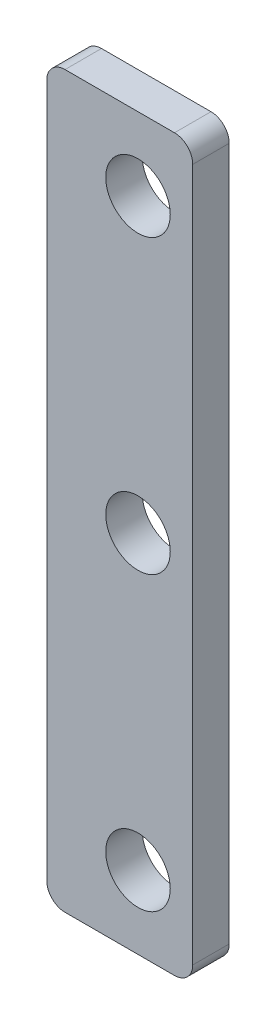
ISO-10303-21;
HEADER;
FILE_DESCRIPTION(('STEP AP214'),'2;1');
FILE_NAME('part.step','',(''),(''),'','','');
FILE_SCHEMA(('AUTOMOTIVE_DESIGN { 1 0 10303 214 1 1 1 1 }'));
ENDSEC;
DATA;
#1=APPLICATION_CONTEXT('core data for automotive mechanical design processes');
#2=APPLICATION_PROTOCOL_DEFINITION('international standard','automotive_design',2000,#1);
#3=PRODUCT_CONTEXT('',#1,'mechanical');
#4=PRODUCT('Part','Part','',(#3));
#5=PRODUCT_RELATED_PRODUCT_CATEGORY('part','',(#4));
#6=PRODUCT_DEFINITION_FORMATION('','',#4);
#7=PRODUCT_DEFINITION_CONTEXT('part definition',#1,'design');
#8=PRODUCT_DEFINITION('design','',#6,#7);
#9=PRODUCT_DEFINITION_SHAPE('','',#8);
#10=(LENGTH_UNIT() NAMED_UNIT(*) SI_UNIT(.MILLI.,.METRE.));
#11=(NAMED_UNIT(*) PLANE_ANGLE_UNIT() SI_UNIT($,.RADIAN.));
#12=(NAMED_UNIT(*) SI_UNIT($,.STERADIAN.) SOLID_ANGLE_UNIT());
#13=UNCERTAINTY_MEASURE_WITH_UNIT(LENGTH_MEASURE(1.E-05),#10,'distance_accuracy_value','');
#14=(GEOMETRIC_REPRESENTATION_CONTEXT(3) GLOBAL_UNCERTAINTY_ASSIGNED_CONTEXT((#13)) GLOBAL_UNIT_ASSIGNED_CONTEXT((#10,
#11,#12)) REPRESENTATION_CONTEXT('',''));
#15=CARTESIAN_POINT('',(0.,0.,0.));
#16=DIRECTION('',(0.,0.,1.));
#17=DIRECTION('',(1.,0.,0.));
#18=AXIS2_PLACEMENT_3D('',#15,#16,#17);
#19=CARTESIAN_POINT('',(6.35,-31.75,3.175));
#20=DIRECTION('',(-1.,0.,0.));
#21=DIRECTION('',(0.,0.,1.));
#22=AXIS2_PLACEMENT_3D('',#19,#20,#21);
#23=PLANE('',#22);
#24=DIRECTION('',(0.,1.,0.));
#25=VECTOR('',#24,1.);
#26=CARTESIAN_POINT('',(6.35,-31.75,3.175));
#27=LINE('',#26,#25);
#28=CARTESIAN_POINT('',(6.35,-30.1625,3.175));
#29=VERTEX_POINT('',#28);
#30=CARTESIAN_POINT('',(6.35,30.1625,3.175));
#31=VERTEX_POINT('',#30);
#32=EDGE_CURVE('E124',#29,#31,#27,.T.);
#33=ORIENTED_EDGE('',*,*,#32,.F.);
#34=DIRECTION('',(0.,0.,-1.));
#35=VECTOR('',#34,1.);
#36=CARTESIAN_POINT('',(6.35,-30.1625,3.175));
#37=LINE('',#36,#35);
#38=CARTESIAN_POINT('',(6.35,-30.1625,0.));
#39=VERTEX_POINT('',#38);
#40=EDGE_CURVE('E155',#29,#39,#37,.T.);
#41=ORIENTED_EDGE('',*,*,#40,.T.);
#42=DIRECTION('',(0.,1.,0.));
#43=VECTOR('',#42,1.);
#44=CARTESIAN_POINT('',(6.35,-31.75,0.));
#45=LINE('',#44,#43);
#46=CARTESIAN_POINT('',(6.35,30.1625,0.));
#47=VERTEX_POINT('',#46);
#48=EDGE_CURVE('E161',#39,#47,#45,.T.);
#49=ORIENTED_EDGE('',*,*,#48,.T.);
#50=DIRECTION('',(0.,0.,-1.));
#51=VECTOR('',#50,1.);
#52=CARTESIAN_POINT('',(6.35,30.1625,3.175));
#53=LINE('',#52,#51);
#54=EDGE_CURVE('E153',#47,#31,#53,.F.);
#55=ORIENTED_EDGE('',*,*,#54,.T.);
#56=EDGE_LOOP('',(#33,#41,#49,#55));
#57=FACE_BOUND('',#56,.T.);
#58=ADVANCED_FACE('F32',(#57),#23,.F.);
#59=CARTESIAN_POINT('',(-6.35,31.75,3.175));
#60=DIRECTION('',(0.,-1.,0.));
#61=DIRECTION('',(0.,0.,-1.));
#62=AXIS2_PLACEMENT_3D('',#59,#60,#61);
#63=PLANE('',#62);
#64=DIRECTION('',(-1.,0.,0.));
#65=VECTOR('',#64,1.);
#66=CARTESIAN_POINT('',(-6.35,31.75,3.175));
#67=LINE('',#66,#65);
#68=CARTESIAN_POINT('',(4.7625,31.75,3.175));
#69=VERTEX_POINT('',#68);
#70=CARTESIAN_POINT('',(-4.7625,31.75,3.175));
#71=VERTEX_POINT('',#70);
#72=EDGE_CURVE('E127',#69,#71,#67,.T.);
#73=ORIENTED_EDGE('',*,*,#72,.F.);
#74=DIRECTION('',(0.,0.,-1.));
#75=VECTOR('',#74,1.);
#76=CARTESIAN_POINT('',(4.7625,31.75,3.175));
#77=LINE('',#76,#75);
#78=CARTESIAN_POINT('',(4.7625,31.75,0.));
#79=VERTEX_POINT('',#78);
#80=EDGE_CURVE('E11',#69,#79,#77,.T.);
#81=ORIENTED_EDGE('',*,*,#80,.T.);
#82=DIRECTION('',(-1.,0.,0.));
#83=VECTOR('',#82,1.);
#84=CARTESIAN_POINT('',(-6.35,31.75,0.));
#85=LINE('',#84,#83);
#86=CARTESIAN_POINT('',(-4.7625,31.75,0.));
#87=VERTEX_POINT('',#86);
#88=EDGE_CURVE('E129',#79,#87,#85,.T.);
#89=ORIENTED_EDGE('',*,*,#88,.T.);
#90=DIRECTION('',(0.,0.,-1.));
#91=VECTOR('',#90,1.);
#92=CARTESIAN_POINT('',(-4.7625,31.75,3.175));
#93=LINE('',#92,#91);
#94=EDGE_CURVE('E40',#87,#71,#93,.F.);
#95=ORIENTED_EDGE('',*,*,#94,.T.);
#96=EDGE_LOOP('',(#73,#81,#89,#95));
#97=FACE_BOUND('',#96,.T.);
#98=ADVANCED_FACE('F202',(#97),#63,.F.);
#99=CARTESIAN_POINT('',(-6.35,-31.75,3.175));
#100=DIRECTION('',(1.,0.,0.));
#101=DIRECTION('',(0.,0.,-1.));
#102=AXIS2_PLACEMENT_3D('',#99,#100,#101);
#103=PLANE('',#102);
#104=DIRECTION('',(0.,-1.,0.));
#105=VECTOR('',#104,1.);
#106=CARTESIAN_POINT('',(-6.35,-31.75,0.));
#107=LINE('',#106,#105);
#108=CARTESIAN_POINT('',(-6.35,30.1625,0.));
#109=VERTEX_POINT('',#108);
#110=CARTESIAN_POINT('',(-6.35,-30.1625,0.));
#111=VERTEX_POINT('',#110);
#112=EDGE_CURVE('E125',#109,#111,#107,.T.);
#113=ORIENTED_EDGE('',*,*,#112,.T.);
#114=DIRECTION('',(0.,0.,-1.));
#115=VECTOR('',#114,1.);
#116=CARTESIAN_POINT('',(-6.35,-30.1625,3.175));
#117=LINE('',#116,#115);
#118=CARTESIAN_POINT('',(-6.35,-30.1625,3.175));
#119=VERTEX_POINT('',#118);
#120=EDGE_CURVE('E103',#111,#119,#117,.F.);
#121=ORIENTED_EDGE('',*,*,#120,.T.);
#122=DIRECTION('',(0.,-1.,0.));
#123=VECTOR('',#122,1.);
#124=CARTESIAN_POINT('',(-6.35,-31.75,3.175));
#125=LINE('',#124,#123);
#126=CARTESIAN_POINT('',(-6.35,30.1625,3.175));
#127=VERTEX_POINT('',#126);
#128=EDGE_CURVE('E173',#127,#119,#125,.T.);
#129=ORIENTED_EDGE('',*,*,#128,.F.);
#130=DIRECTION('',(0.,0.,-1.));
#131=VECTOR('',#130,1.);
#132=CARTESIAN_POINT('',(-6.35,30.1625,3.175));
#133=LINE('',#132,#131);
#134=EDGE_CURVE('E108',#127,#109,#133,.T.);
#135=ORIENTED_EDGE('',*,*,#134,.T.);
#136=EDGE_LOOP('',(#113,#121,#129,#135));
#137=FACE_BOUND('',#136,.T.);
#138=ADVANCED_FACE('F200',(#137),#103,.F.);
#139=CARTESIAN_POINT('',(-6.35,-31.75,3.175));
#140=DIRECTION('',(0.,1.,0.));
#141=DIRECTION('',(0.,0.,1.));
#142=AXIS2_PLACEMENT_3D('',#139,#140,#141);
#143=PLANE('',#142);
#144=DIRECTION('',(1.,0.,0.));
#145=VECTOR('',#144,1.);
#146=CARTESIAN_POINT('',(-6.35,-31.75,3.175));
#147=LINE('',#146,#145);
#148=CARTESIAN_POINT('',(-4.7625,-31.75,3.175));
#149=VERTEX_POINT('',#148);
#150=CARTESIAN_POINT('',(4.7625,-31.75,3.175));
#151=VERTEX_POINT('',#150);
#152=EDGE_CURVE('E118',#149,#151,#147,.T.);
#153=ORIENTED_EDGE('',*,*,#152,.F.);
#154=DIRECTION('',(0.,0.,-1.));
#155=VECTOR('',#154,1.);
#156=CARTESIAN_POINT('',(-4.7625,-31.75,3.175));
#157=LINE('',#156,#155);
#158=CARTESIAN_POINT('',(-4.7625,-31.75,0.));
#159=VERTEX_POINT('',#158);
#160=EDGE_CURVE('E102',#149,#159,#157,.T.);
#161=ORIENTED_EDGE('',*,*,#160,.T.);
#162=DIRECTION('',(1.,0.,0.));
#163=VECTOR('',#162,1.);
#164=CARTESIAN_POINT('',(-6.35,-31.75,0.));
#165=LINE('',#164,#163);
#166=CARTESIAN_POINT('',(4.7625,-31.75,0.));
#167=VERTEX_POINT('',#166);
#168=EDGE_CURVE('E115',#159,#167,#165,.T.);
#169=ORIENTED_EDGE('',*,*,#168,.T.);
#170=DIRECTION('',(0.,0.,-1.));
#171=VECTOR('',#170,1.);
#172=CARTESIAN_POINT('',(4.7625,-31.75,3.175));
#173=LINE('',#172,#171);
#174=EDGE_CURVE('E120',#167,#151,#173,.F.);
#175=ORIENTED_EDGE('',*,*,#174,.T.);
#176=EDGE_LOOP('',(#153,#161,#169,#175));
#177=FACE_BOUND('',#176,.T.);
#178=ADVANCED_FACE('F114',(#177),#143,.F.);
#179=CARTESIAN_POINT('',(0.,0.,3.175));
#180=DIRECTION('',(0.,0.,-1.));
#181=DIRECTION('',(-1.,0.,0.));
#182=AXIS2_PLACEMENT_3D('',#179,#180,#181);
#183=PLANE('',#182);
#184=CARTESIAN_POINT('',(1.5875,0.,3.175));
#185=DIRECTION('',(0.,0.,1.));
#186=DIRECTION('',(1.,0.,0.));
#187=AXIS2_PLACEMENT_3D('',#184,#185,#186);
#188=CIRCLE('',#187,2.80669999999999);
#189=CARTESIAN_POINT('',(4.3942,0.,3.175));
#190=VERTEX_POINT('',#189);
#191=EDGE_CURVE('E137',#190,#190,#188,.T.);
#192=ORIENTED_EDGE('',*,*,#191,.F.);
#193=EDGE_LOOP('',(#192));
#194=FACE_BOUND('',#193,.T.);
#195=CARTESIAN_POINT('',(1.5875,25.4,3.175));
#196=DIRECTION('',(0.,0.,1.));
#197=DIRECTION('',(1.,0.,0.));
#198=AXIS2_PLACEMENT_3D('',#195,#196,#197);
#199=CIRCLE('',#198,2.80669999999999);
#200=CARTESIAN_POINT('',(4.39419999999999,25.4,3.175));
#201=VERTEX_POINT('',#200);
#202=EDGE_CURVE('E136',#201,#201,#199,.T.);
#203=ORIENTED_EDGE('',*,*,#202,.F.);
#204=EDGE_LOOP('',(#203));
#205=FACE_BOUND('',#204,.T.);
#206=CARTESIAN_POINT('',(1.58750000000001,-25.4,3.175));
#207=DIRECTION('',(0.,0.,1.));
#208=DIRECTION('',(1.,0.,0.));
#209=AXIS2_PLACEMENT_3D('',#206,#207,#208);
#210=CIRCLE('',#209,2.80669999999999);
#211=CARTESIAN_POINT('',(4.3942,-25.4,3.175));
#212=VERTEX_POINT('',#211);
#213=EDGE_CURVE('E169',#212,#212,#210,.T.);
#214=ORIENTED_EDGE('',*,*,#213,.F.);
#215=EDGE_LOOP('',(#214));
#216=FACE_BOUND('',#215,.T.);
#217=ORIENTED_EDGE('',*,*,#128,.T.);
#218=CARTESIAN_POINT('',(-4.7625,-30.1625,3.175));
#219=DIRECTION('',(0.,0.,-1.));
#220=DIRECTION('',(-1.,0.,0.));
#221=AXIS2_PLACEMENT_3D('',#218,#219,#220);
#222=CIRCLE('',#221,1.5875);
#223=EDGE_CURVE('E151',#119,#149,#222,.F.);
#224=ORIENTED_EDGE('',*,*,#223,.T.);
#225=ORIENTED_EDGE('',*,*,#152,.T.);
#226=CARTESIAN_POINT('',(4.7625,-30.1625,3.175));
#227=DIRECTION('',(0.,0.,-1.));
#228=DIRECTION('',(-1.,0.,0.));
#229=AXIS2_PLACEMENT_3D('',#226,#227,#228);
#230=CIRCLE('',#229,1.5875);
#231=EDGE_CURVE('E149',#151,#29,#230,.F.);
#232=ORIENTED_EDGE('',*,*,#231,.T.);
#233=ORIENTED_EDGE('',*,*,#32,.T.);
#234=CARTESIAN_POINT('',(4.7625,30.1625,3.175));
#235=DIRECTION('',(0.,0.,-1.));
#236=DIRECTION('',(-1.,0.,0.));
#237=AXIS2_PLACEMENT_3D('',#234,#235,#236);
#238=CIRCLE('',#237,1.5875);
#239=EDGE_CURVE('E53',#31,#69,#238,.F.);
#240=ORIENTED_EDGE('',*,*,#239,.T.);
#241=ORIENTED_EDGE('',*,*,#72,.T.);
#242=CARTESIAN_POINT('',(-4.7625,30.1625,3.175));
#243=DIRECTION('',(0.,0.,-1.));
#244=DIRECTION('',(-1.,0.,0.));
#245=AXIS2_PLACEMENT_3D('',#242,#243,#244);
#246=CIRCLE('',#245,1.5875);
#247=EDGE_CURVE('E146',#71,#127,#246,.F.);
#248=ORIENTED_EDGE('',*,*,#247,.T.);
#249=EDGE_LOOP('',(#217,#224,#225,#232,#233,#240,#241,#248));
#250=FACE_BOUND('',#249,.T.);
#251=ADVANCED_FACE('F189',(#194,#205,#216,#250),#183,.F.);
#252=CARTESIAN_POINT('',(0.,0.,0.));
#253=DIRECTION('',(0.,0.,-1.));
#254=DIRECTION('',(-1.,0.,0.));
#255=AXIS2_PLACEMENT_3D('',#252,#253,#254);
#256=PLANE('',#255);
#257=CARTESIAN_POINT('',(1.5875,0.,0.));
#258=DIRECTION('',(0.,0.,-1.));
#259=DIRECTION('',(-1.,0.,0.));
#260=AXIS2_PLACEMENT_3D('',#257,#258,#259);
#261=CIRCLE('',#260,2.80669999999999);
#262=CARTESIAN_POINT('',(-1.21919999999998,0.,0.));
#263=VERTEX_POINT('',#262);
#264=EDGE_CURVE('E133',#263,#263,#261,.T.);
#265=ORIENTED_EDGE('',*,*,#264,.F.);
#266=EDGE_LOOP('',(#265));
#267=FACE_BOUND('',#266,.T.);
#268=CARTESIAN_POINT('',(1.5875,25.4,0.));
#269=DIRECTION('',(0.,0.,-1.));
#270=DIRECTION('',(-1.,0.,0.));
#271=AXIS2_PLACEMENT_3D('',#268,#269,#270);
#272=CIRCLE('',#271,2.80669999999999);
#273=CARTESIAN_POINT('',(-1.21919999999999,25.4,0.));
#274=VERTEX_POINT('',#273);
#275=EDGE_CURVE('E179',#274,#274,#272,.T.);
#276=ORIENTED_EDGE('',*,*,#275,.F.);
#277=EDGE_LOOP('',(#276));
#278=FACE_BOUND('',#277,.T.);
#279=CARTESIAN_POINT('',(1.58750000000001,-25.4,0.));
#280=DIRECTION('',(0.,0.,-1.));
#281=DIRECTION('',(-1.,0.,0.));
#282=AXIS2_PLACEMENT_3D('',#279,#280,#281);
#283=CIRCLE('',#282,2.80669999999999);
#284=CARTESIAN_POINT('',(-1.21919999999998,-25.4,0.));
#285=VERTEX_POINT('',#284);
#286=EDGE_CURVE('E166',#285,#285,#283,.T.);
#287=ORIENTED_EDGE('',*,*,#286,.F.);
#288=EDGE_LOOP('',(#287));
#289=FACE_BOUND('',#288,.T.);
#290=ORIENTED_EDGE('',*,*,#168,.F.);
#291=CARTESIAN_POINT('',(-4.7625,-30.1625,0.));
#292=DIRECTION('',(0.,0.,-1.));
#293=DIRECTION('',(-1.,0.,0.));
#294=AXIS2_PLACEMENT_3D('',#291,#292,#293);
#295=CIRCLE('',#294,1.5875);
#296=EDGE_CURVE('E98',#159,#111,#295,.T.);
#297=ORIENTED_EDGE('',*,*,#296,.T.);
#298=ORIENTED_EDGE('',*,*,#112,.F.);
#299=CARTESIAN_POINT('',(-4.7625,30.1625,0.));
#300=DIRECTION('',(0.,0.,-1.));
#301=DIRECTION('',(-1.,0.,0.));
#302=AXIS2_PLACEMENT_3D('',#299,#300,#301);
#303=CIRCLE('',#302,1.5875);
#304=EDGE_CURVE('E119',#109,#87,#303,.T.);
#305=ORIENTED_EDGE('',*,*,#304,.T.);
#306=ORIENTED_EDGE('',*,*,#88,.F.);
#307=CARTESIAN_POINT('',(4.7625,30.1625,0.));
#308=DIRECTION('',(0.,0.,-1.));
#309=DIRECTION('',(-1.,0.,0.));
#310=AXIS2_PLACEMENT_3D('',#307,#308,#309);
#311=CIRCLE('',#310,1.5875);
#312=EDGE_CURVE('E140',#79,#47,#311,.T.);
#313=ORIENTED_EDGE('',*,*,#312,.T.);
#314=ORIENTED_EDGE('',*,*,#48,.F.);
#315=CARTESIAN_POINT('',(4.7625,-30.1625,0.));
#316=DIRECTION('',(0.,0.,-1.));
#317=DIRECTION('',(-1.,0.,0.));
#318=AXIS2_PLACEMENT_3D('',#315,#316,#317);
#319=CIRCLE('',#318,1.5875);
#320=EDGE_CURVE('E109',#39,#167,#319,.T.);
#321=ORIENTED_EDGE('',*,*,#320,.T.);
#322=EDGE_LOOP('',(#290,#297,#298,#305,#306,#313,#314,#321));
#323=FACE_BOUND('',#322,.T.);
#324=ADVANCED_FACE('F122',(#267,#278,#289,#323),#256,.T.);
#325=CARTESIAN_POINT('',(1.58750000000001,-25.4,3.175));
#326=DIRECTION('',(0.,0.,1.));
#327=DIRECTION('',(1.,0.,0.));
#328=AXIS2_PLACEMENT_3D('',#325,#326,#327);
#329=CYLINDRICAL_SURFACE('',#328,2.80669999999999);
#330=ORIENTED_EDGE('',*,*,#286,.T.);
#331=EDGE_LOOP('',(#330));
#332=FACE_BOUND('',#331,.T.);
#333=ORIENTED_EDGE('',*,*,#213,.T.);
#334=EDGE_LOOP('',(#333));
#335=FACE_BOUND('',#334,.T.);
#336=ADVANCED_FACE('F226',(#332,#335),#329,.F.);
#337=CARTESIAN_POINT('',(1.5875,25.4,3.175));
#338=DIRECTION('',(0.,0.,1.));
#339=DIRECTION('',(1.,0.,0.));
#340=AXIS2_PLACEMENT_3D('',#337,#338,#339);
#341=CYLINDRICAL_SURFACE('',#340,2.80669999999999);
#342=ORIENTED_EDGE('',*,*,#275,.T.);
#343=EDGE_LOOP('',(#342));
#344=FACE_BOUND('',#343,.T.);
#345=ORIENTED_EDGE('',*,*,#202,.T.);
#346=EDGE_LOOP('',(#345));
#347=FACE_BOUND('',#346,.T.);
#348=ADVANCED_FACE('F231',(#344,#347),#341,.F.);
#349=CARTESIAN_POINT('',(1.5875,0.,3.175));
#350=DIRECTION('',(0.,0.,1.));
#351=DIRECTION('',(1.,0.,0.));
#352=AXIS2_PLACEMENT_3D('',#349,#350,#351);
#353=CYLINDRICAL_SURFACE('',#352,2.80669999999999);
#354=ORIENTED_EDGE('',*,*,#264,.T.);
#355=EDGE_LOOP('',(#354));
#356=FACE_BOUND('',#355,.T.);
#357=ORIENTED_EDGE('',*,*,#191,.T.);
#358=EDGE_LOOP('',(#357));
#359=FACE_BOUND('',#358,.T.);
#360=ADVANCED_FACE('F187',(#356,#359),#353,.F.);
#361=CARTESIAN_POINT('',(-4.7625,-30.1625,3.175));
#362=DIRECTION('',(0.,0.,-1.));
#363=DIRECTION('',(-1.,0.,0.));
#364=AXIS2_PLACEMENT_3D('',#361,#362,#363);
#365=CYLINDRICAL_SURFACE('',#364,1.5875);
#366=ORIENTED_EDGE('',*,*,#223,.F.);
#367=ORIENTED_EDGE('',*,*,#120,.F.);
#368=ORIENTED_EDGE('',*,*,#296,.F.);
#369=ORIENTED_EDGE('',*,*,#160,.F.);
#370=EDGE_LOOP('',(#366,#367,#368,#369));
#371=FACE_BOUND('',#370,.T.);
#372=ADVANCED_FACE('F101',(#371),#365,.T.);
#373=CARTESIAN_POINT('',(4.7625,-30.1625,3.175));
#374=DIRECTION('',(0.,0.,-1.));
#375=DIRECTION('',(-1.,0.,0.));
#376=AXIS2_PLACEMENT_3D('',#373,#374,#375);
#377=CYLINDRICAL_SURFACE('',#376,1.5875);
#378=ORIENTED_EDGE('',*,*,#231,.F.);
#379=ORIENTED_EDGE('',*,*,#174,.F.);
#380=ORIENTED_EDGE('',*,*,#320,.F.);
#381=ORIENTED_EDGE('',*,*,#40,.F.);
#382=EDGE_LOOP('',(#378,#379,#380,#381));
#383=FACE_BOUND('',#382,.T.);
#384=ADVANCED_FACE('F206',(#383),#377,.T.);
#385=CARTESIAN_POINT('',(4.7625,30.1625,3.175));
#386=DIRECTION('',(0.,0.,-1.));
#387=DIRECTION('',(-1.,0.,0.));
#388=AXIS2_PLACEMENT_3D('',#385,#386,#387);
#389=CYLINDRICAL_SURFACE('',#388,1.5875);
#390=ORIENTED_EDGE('',*,*,#239,.F.);
#391=ORIENTED_EDGE('',*,*,#54,.F.);
#392=ORIENTED_EDGE('',*,*,#312,.F.);
#393=ORIENTED_EDGE('',*,*,#80,.F.);
#394=EDGE_LOOP('',(#390,#391,#392,#393));
#395=FACE_BOUND('',#394,.T.);
#396=ADVANCED_FACE('F205',(#395),#389,.T.);
#397=CARTESIAN_POINT('',(-4.7625,30.1625,3.175));
#398=DIRECTION('',(0.,0.,-1.));
#399=DIRECTION('',(-1.,0.,0.));
#400=AXIS2_PLACEMENT_3D('',#397,#398,#399);
#401=CYLINDRICAL_SURFACE('',#400,1.5875);
#402=ORIENTED_EDGE('',*,*,#247,.F.);
#403=ORIENTED_EDGE('',*,*,#94,.F.);
#404=ORIENTED_EDGE('',*,*,#304,.F.);
#405=ORIENTED_EDGE('',*,*,#134,.F.);
#406=EDGE_LOOP('',(#402,#403,#404,#405));
#407=FACE_BOUND('',#406,.T.);
#408=ADVANCED_FACE('F34',(#407),#401,.T.);
#409=CLOSED_SHELL('',(#58,#98,#138,#178,#251,#324,#336,#348,#360,#372,#384,#396,#408));
#410=MANIFOLD_SOLID_BREP('B2',#409);
#411=ADVANCED_BREP_SHAPE_REPRESENTATION('',(#18,#410),#14);
#412=SHAPE_DEFINITION_REPRESENTATION(#9,#411);
ENDSEC;
END-ISO-10303-21;
